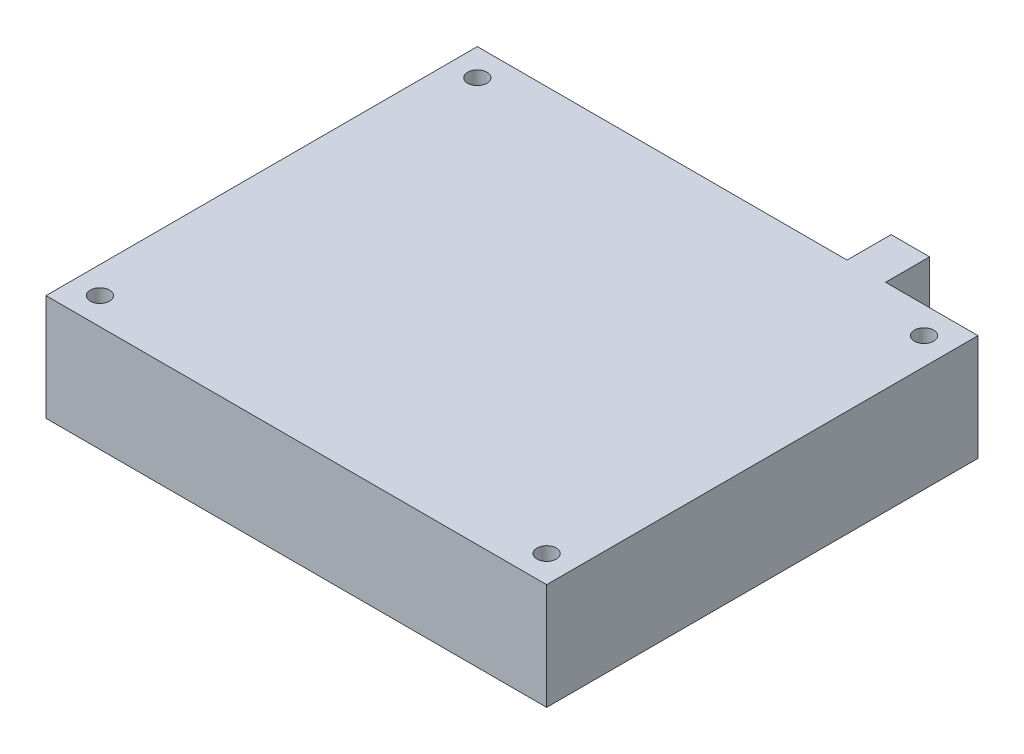
ISO-10303-21;
HEADER;
FILE_DESCRIPTION(('STEP AP214'),'2;1');
FILE_NAME('part.step','',(''),(''),'','','');
FILE_SCHEMA(('AUTOMOTIVE_DESIGN { 1 0 10303 214 1 1 1 1 }'));
ENDSEC;
DATA;
#1=APPLICATION_CONTEXT('core data for automotive mechanical design processes');
#2=APPLICATION_PROTOCOL_DEFINITION('international standard','automotive_design',2000,#1);
#3=PRODUCT_CONTEXT('',#1,'mechanical');
#4=PRODUCT('Part','Part','',(#3));
#5=PRODUCT_RELATED_PRODUCT_CATEGORY('part','',(#4));
#6=PRODUCT_DEFINITION_FORMATION('','',#4);
#7=PRODUCT_DEFINITION_CONTEXT('part definition',#1,'design');
#8=PRODUCT_DEFINITION('design','',#6,#7);
#9=PRODUCT_DEFINITION_SHAPE('','',#8);
#10=(LENGTH_UNIT() NAMED_UNIT(*) SI_UNIT(.MILLI.,.METRE.));
#11=(NAMED_UNIT(*) PLANE_ANGLE_UNIT() SI_UNIT($,.RADIAN.));
#12=(NAMED_UNIT(*) SI_UNIT($,.STERADIAN.) SOLID_ANGLE_UNIT());
#13=UNCERTAINTY_MEASURE_WITH_UNIT(LENGTH_MEASURE(1.E-05),#10,'distance_accuracy_value','');
#14=(GEOMETRIC_REPRESENTATION_CONTEXT(3) GLOBAL_UNCERTAINTY_ASSIGNED_CONTEXT((#13)) GLOBAL_UNIT_ASSIGNED_CONTEXT((#10,
#11,#12)) REPRESENTATION_CONTEXT('',''));
#15=CARTESIAN_POINT('',(0.,0.,0.));
#16=DIRECTION('',(0.,0.,1.));
#17=DIRECTION('',(1.,0.,0.));
#18=AXIS2_PLACEMENT_3D('',#15,#16,#17);
#19=CARTESIAN_POINT('',(-32.5,13.8,-28.));
#20=DIRECTION('',(0.,0.,1.));
#21=DIRECTION('',(1.,0.,0.));
#22=AXIS2_PLACEMENT_3D('',#19,#20,#21);
#23=PLANE('',#22);
#24=DIRECTION('',(0.,1.,0.));
#25=VECTOR('',#24,1.);
#26=CARTESIAN_POINT('',(15.5,-7.597262664934,-28.));
#27=LINE('',#26,#25);
#28=CARTESIAN_POINT('',(15.5,0.,-28.));
#29=VERTEX_POINT('',#28);
#30=CARTESIAN_POINT('',(15.5,13.8,-28.));
#31=VERTEX_POINT('',#30);
#32=EDGE_CURVE('E144',#29,#31,#27,.T.);
#33=ORIENTED_EDGE('',*,*,#32,.F.);
#34=DIRECTION('',(-1.,0.,0.));
#35=VECTOR('',#34,1.);
#36=CARTESIAN_POINT('',(-32.5,0.,-28.));
#37=LINE('',#36,#35);
#38=CARTESIAN_POINT('',(-32.5,0.,-28.));
#39=VERTEX_POINT('',#38);
#40=EDGE_CURVE('E184',#29,#39,#37,.T.);
#41=ORIENTED_EDGE('',*,*,#40,.T.);
#42=DIRECTION('',(0.,-1.,0.));
#43=VECTOR('',#42,1.);
#44=CARTESIAN_POINT('',(-32.5,13.8,-28.));
#45=LINE('',#44,#43);
#46=CARTESIAN_POINT('',(-32.5,13.8,-28.));
#47=VERTEX_POINT('',#46);
#48=EDGE_CURVE('E49',#47,#39,#45,.T.);
#49=ORIENTED_EDGE('',*,*,#48,.F.);
#50=DIRECTION('',(-1.,0.,0.));
#51=VECTOR('',#50,1.);
#52=CARTESIAN_POINT('',(-32.5,13.8,-28.));
#53=LINE('',#52,#51);
#54=EDGE_CURVE('E176',#31,#47,#53,.T.);
#55=ORIENTED_EDGE('',*,*,#54,.F.);
#56=EDGE_LOOP('',(#33,#41,#49,#55));
#57=FACE_BOUND('',#56,.T.);
#58=ADVANCED_FACE('F41',(#57),#23,.F.);
#59=CARTESIAN_POINT('',(0.,13.8,0.));
#60=DIRECTION('',(0.,-1.,0.));
#61=DIRECTION('',(0.,0.,-1.));
#62=AXIS2_PLACEMENT_3D('',#59,#60,#61);
#63=PLANE('',#62);
#64=DIRECTION('',(0.,0.,-1.));
#65=VECTOR('',#64,1.);
#66=CARTESIAN_POINT('',(32.5,13.8,28.));
#67=LINE('',#66,#65);
#68=CARTESIAN_POINT('',(32.5,13.8,28.));
#69=VERTEX_POINT('',#68);
#70=CARTESIAN_POINT('',(32.5,13.8,-28.));
#71=VERTEX_POINT('',#70);
#72=EDGE_CURVE('E174',#69,#71,#67,.T.);
#73=ORIENTED_EDGE('',*,*,#72,.T.);
#74=CARTESIAN_POINT('',(20.5,13.8,-28.));
#75=VERTEX_POINT('',#74);
#76=EDGE_CURVE('E92',#71,#75,#53,.T.);
#77=ORIENTED_EDGE('',*,*,#76,.T.);
#78=DIRECTION('',(0.,0.,-1.));
#79=VECTOR('',#78,1.);
#80=CARTESIAN_POINT('',(20.5,13.8,-33.72));
#81=LINE('',#80,#79);
#82=CARTESIAN_POINT('',(20.5,13.8,-33.72));
#83=VERTEX_POINT('',#82);
#84=EDGE_CURVE('E56',#75,#83,#81,.T.);
#85=ORIENTED_EDGE('',*,*,#84,.T.);
#86=DIRECTION('',(-1.,0.,0.));
#87=VECTOR('',#86,1.);
#88=CARTESIAN_POINT('',(15.5,13.8,-33.72));
#89=LINE('',#88,#87);
#90=CARTESIAN_POINT('',(15.5,13.8,-33.72));
#91=VERTEX_POINT('',#90);
#92=EDGE_CURVE('E132',#83,#91,#89,.T.);
#93=ORIENTED_EDGE('',*,*,#92,.T.);
#94=DIRECTION('',(0.,0.,1.));
#95=VECTOR('',#94,1.);
#96=CARTESIAN_POINT('',(15.5,13.8,-28.));
#97=LINE('',#96,#95);
#98=EDGE_CURVE('E137',#91,#31,#97,.T.);
#99=ORIENTED_EDGE('',*,*,#98,.T.);
#100=ORIENTED_EDGE('',*,*,#54,.T.);
#101=DIRECTION('',(0.,0.,1.));
#102=VECTOR('',#101,1.);
#103=CARTESIAN_POINT('',(-32.5,13.8,28.));
#104=LINE('',#103,#102);
#105=CARTESIAN_POINT('',(-32.5,13.8,28.));
#106=VERTEX_POINT('',#105);
#107=EDGE_CURVE('E178',#47,#106,#104,.T.);
#108=ORIENTED_EDGE('',*,*,#107,.T.);
#109=DIRECTION('',(1.,0.,0.));
#110=VECTOR('',#109,1.);
#111=CARTESIAN_POINT('',(-32.5,13.8,28.));
#112=LINE('',#111,#110);
#113=EDGE_CURVE('E65',#106,#69,#112,.T.);
#114=ORIENTED_EDGE('',*,*,#113,.T.);
#115=EDGE_LOOP('',(#73,#77,#85,#93,#99,#100,#108,#114));
#116=FACE_BOUND('',#115,.T.);
#117=CARTESIAN_POINT('',(-29.,13.8,-24.5));
#118=DIRECTION('',(0.,1.,0.));
#119=DIRECTION('',(0.,0.,1.));
#120=AXIS2_PLACEMENT_3D('',#117,#118,#119);
#121=CIRCLE('',#120,1.25);
#122=CARTESIAN_POINT('',(-29.,13.8,-25.75));
#123=VERTEX_POINT('',#122);
#124=EDGE_CURVE('E168',#123,#123,#121,.T.);
#125=ORIENTED_EDGE('',*,*,#124,.F.);
#126=EDGE_LOOP('',(#125));
#127=FACE_BOUND('',#126,.T.);
#128=CARTESIAN_POINT('',(29.,13.8,-24.5));
#129=DIRECTION('',(0.,1.,0.));
#130=DIRECTION('',(0.,0.,-1.));
#131=AXIS2_PLACEMENT_3D('',#128,#129,#130);
#132=CIRCLE('',#131,1.25);
#133=CARTESIAN_POINT('',(29.,13.8,-25.75));
#134=VERTEX_POINT('',#133);
#135=EDGE_CURVE('E162',#134,#134,#132,.T.);
#136=ORIENTED_EDGE('',*,*,#135,.F.);
#137=EDGE_LOOP('',(#136));
#138=FACE_BOUND('',#137,.T.);
#139=CARTESIAN_POINT('',(29.,13.8,24.5));
#140=DIRECTION('',(0.,1.,0.));
#141=DIRECTION('',(0.,0.,1.));
#142=AXIS2_PLACEMENT_3D('',#139,#140,#141);
#143=CIRCLE('',#142,1.25);
#144=CARTESIAN_POINT('',(29.,13.8,23.25));
#145=VERTEX_POINT('',#144);
#146=EDGE_CURVE('E156',#145,#145,#143,.T.);
#147=ORIENTED_EDGE('',*,*,#146,.F.);
#148=EDGE_LOOP('',(#147));
#149=FACE_BOUND('',#148,.T.);
#150=CARTESIAN_POINT('',(-29.,13.8,24.5));
#151=DIRECTION('',(0.,1.,0.));
#152=DIRECTION('',(0.,0.,-1.));
#153=AXIS2_PLACEMENT_3D('',#150,#151,#152);
#154=CIRCLE('',#153,1.25);
#155=CARTESIAN_POINT('',(-29.,13.8,23.25));
#156=VERTEX_POINT('',#155);
#157=EDGE_CURVE('E150',#156,#156,#154,.T.);
#158=ORIENTED_EDGE('',*,*,#157,.F.);
#159=EDGE_LOOP('',(#158));
#160=FACE_BOUND('',#159,.T.);
#161=ADVANCED_FACE('F219',(#116,#127,#138,#149,#160),#63,.F.);
#162=CARTESIAN_POINT('',(0.,0.,0.));
#163=DIRECTION('',(0.,-1.,0.));
#164=DIRECTION('',(0.,0.,-1.));
#165=AXIS2_PLACEMENT_3D('',#162,#163,#164);
#166=PLANE('',#165);
#167=CARTESIAN_POINT('',(29.,0.,24.5));
#168=DIRECTION('',(0.,1.,0.));
#169=DIRECTION('',(0.,0.,1.));
#170=AXIS2_PLACEMENT_3D('',#167,#168,#169);
#171=CIRCLE('',#170,1.25);
#172=CARTESIAN_POINT('',(29.,0.,23.25));
#173=VERTEX_POINT('',#172);
#174=EDGE_CURVE('E153',#173,#173,#171,.T.);
#175=ORIENTED_EDGE('',*,*,#174,.T.);
#176=EDGE_LOOP('',(#175));
#177=FACE_BOUND('',#176,.T.);
#178=CARTESIAN_POINT('',(-29.,0.,-24.5));
#179=DIRECTION('',(0.,1.,0.));
#180=DIRECTION('',(0.,0.,1.));
#181=AXIS2_PLACEMENT_3D('',#178,#179,#180);
#182=CIRCLE('',#181,1.25);
#183=CARTESIAN_POINT('',(-29.,0.,-25.75));
#184=VERTEX_POINT('',#183);
#185=EDGE_CURVE('E165',#184,#184,#182,.T.);
#186=ORIENTED_EDGE('',*,*,#185,.T.);
#187=EDGE_LOOP('',(#186));
#188=FACE_BOUND('',#187,.T.);
#189=DIRECTION('',(0.,0.,-1.));
#190=VECTOR('',#189,1.);
#191=CARTESIAN_POINT('',(32.5,0.,28.));
#192=LINE('',#191,#190);
#193=CARTESIAN_POINT('',(32.5,0.,28.));
#194=VERTEX_POINT('',#193);
#195=CARTESIAN_POINT('',(32.5,0.,-28.));
#196=VERTEX_POINT('',#195);
#197=EDGE_CURVE('E171',#194,#196,#192,.T.);
#198=ORIENTED_EDGE('',*,*,#197,.F.);
#199=DIRECTION('',(1.,0.,0.));
#200=VECTOR('',#199,1.);
#201=CARTESIAN_POINT('',(-32.5,0.,28.));
#202=LINE('',#201,#200);
#203=CARTESIAN_POINT('',(-32.5,0.,28.));
#204=VERTEX_POINT('',#203);
#205=EDGE_CURVE('E86',#204,#194,#202,.T.);
#206=ORIENTED_EDGE('',*,*,#205,.F.);
#207=DIRECTION('',(0.,0.,1.));
#208=VECTOR('',#207,1.);
#209=CARTESIAN_POINT('',(-32.5,0.,28.));
#210=LINE('',#209,#208);
#211=EDGE_CURVE('E187',#39,#204,#210,.T.);
#212=ORIENTED_EDGE('',*,*,#211,.F.);
#213=ORIENTED_EDGE('',*,*,#40,.F.);
#214=DIRECTION('',(0.,0.,1.));
#215=VECTOR('',#214,1.);
#216=CARTESIAN_POINT('',(15.5,0.,-28.));
#217=LINE('',#216,#215);
#218=CARTESIAN_POINT('',(15.5,0.,-33.72));
#219=VERTEX_POINT('',#218);
#220=EDGE_CURVE('E123',#219,#29,#217,.T.);
#221=ORIENTED_EDGE('',*,*,#220,.F.);
#222=DIRECTION('',(-1.,0.,0.));
#223=VECTOR('',#222,1.);
#224=CARTESIAN_POINT('',(15.5,0.,-33.72));
#225=LINE('',#224,#223);
#226=CARTESIAN_POINT('',(20.5,0.,-33.72));
#227=VERTEX_POINT('',#226);
#228=EDGE_CURVE('E115',#227,#219,#225,.T.);
#229=ORIENTED_EDGE('',*,*,#228,.F.);
#230=DIRECTION('',(0.,0.,-1.));
#231=VECTOR('',#230,1.);
#232=CARTESIAN_POINT('',(20.5,0.,-33.72));
#233=LINE('',#232,#231);
#234=CARTESIAN_POINT('',(20.5,0.,-28.));
#235=VERTEX_POINT('',#234);
#236=EDGE_CURVE('E121',#235,#227,#233,.T.);
#237=ORIENTED_EDGE('',*,*,#236,.F.);
#238=EDGE_CURVE('E185',#196,#235,#37,.T.);
#239=ORIENTED_EDGE('',*,*,#238,.F.);
#240=EDGE_LOOP('',(#198,#206,#212,#213,#221,#229,#237,#239));
#241=FACE_BOUND('',#240,.T.);
#242=CARTESIAN_POINT('',(29.,0.,-24.5));
#243=DIRECTION('',(0.,1.,0.));
#244=DIRECTION('',(0.,0.,-1.));
#245=AXIS2_PLACEMENT_3D('',#242,#243,#244);
#246=CIRCLE('',#245,1.25);
#247=CARTESIAN_POINT('',(29.,0.,-25.75));
#248=VERTEX_POINT('',#247);
#249=EDGE_CURVE('E159',#248,#248,#246,.T.);
#250=ORIENTED_EDGE('',*,*,#249,.T.);
#251=EDGE_LOOP('',(#250));
#252=FACE_BOUND('',#251,.T.);
#253=CARTESIAN_POINT('',(-29.,0.,24.5));
#254=DIRECTION('',(0.,1.,0.));
#255=DIRECTION('',(0.,0.,-1.));
#256=AXIS2_PLACEMENT_3D('',#253,#254,#255);
#257=CIRCLE('',#256,1.25);
#258=CARTESIAN_POINT('',(-29.,0.,23.25));
#259=VERTEX_POINT('',#258);
#260=EDGE_CURVE('E149',#259,#259,#257,.T.);
#261=ORIENTED_EDGE('',*,*,#260,.T.);
#262=EDGE_LOOP('',(#261));
#263=FACE_BOUND('',#262,.T.);
#264=ADVANCED_FACE('F118',(#177,#188,#241,#252,#263),#166,.T.);
#265=CARTESIAN_POINT('',(32.5,13.8,28.));
#266=DIRECTION('',(-1.,0.,0.));
#267=DIRECTION('',(0.,0.,1.));
#268=AXIS2_PLACEMENT_3D('',#265,#266,#267);
#269=PLANE('',#268);
#270=ORIENTED_EDGE('',*,*,#197,.T.);
#271=DIRECTION('',(0.,-1.,0.));
#272=VECTOR('',#271,1.);
#273=CARTESIAN_POINT('',(32.5,13.8,-28.));
#274=LINE('',#273,#272);
#275=EDGE_CURVE('E11',#71,#196,#274,.T.);
#276=ORIENTED_EDGE('',*,*,#275,.F.);
#277=ORIENTED_EDGE('',*,*,#72,.F.);
#278=DIRECTION('',(0.,-1.,0.));
#279=VECTOR('',#278,1.);
#280=CARTESIAN_POINT('',(32.5,13.8,28.));
#281=LINE('',#280,#279);
#282=EDGE_CURVE('E181',#69,#194,#281,.T.);
#283=ORIENTED_EDGE('',*,*,#282,.T.);
#284=EDGE_LOOP('',(#270,#276,#277,#283));
#285=FACE_BOUND('',#284,.T.);
#286=ADVANCED_FACE('F43',(#285),#269,.F.);
#287=ORIENTED_EDGE('',*,*,#238,.T.);
#288=DIRECTION('',(0.,1.,0.));
#289=VECTOR('',#288,1.);
#290=CARTESIAN_POINT('',(20.5,-7.597262664934,-28.));
#291=LINE('',#290,#289);
#292=EDGE_CURVE('E135',#235,#75,#291,.T.);
#293=ORIENTED_EDGE('',*,*,#292,.T.);
#294=ORIENTED_EDGE('',*,*,#76,.F.);
#295=ORIENTED_EDGE('',*,*,#275,.T.);
#296=EDGE_LOOP('',(#287,#293,#294,#295));
#297=FACE_BOUND('',#296,.T.);
#298=ADVANCED_FACE('F215',(#297),#23,.F.);
#299=CARTESIAN_POINT('',(-32.5,13.8,28.));
#300=DIRECTION('',(1.,0.,0.));
#301=DIRECTION('',(0.,0.,-1.));
#302=AXIS2_PLACEMENT_3D('',#299,#300,#301);
#303=PLANE('',#302);
#304=ORIENTED_EDGE('',*,*,#211,.T.);
#305=DIRECTION('',(0.,-1.,0.));
#306=VECTOR('',#305,1.);
#307=CARTESIAN_POINT('',(-32.5,13.8,28.));
#308=LINE('',#307,#306);
#309=EDGE_CURVE('E191',#106,#204,#308,.T.);
#310=ORIENTED_EDGE('',*,*,#309,.F.);
#311=ORIENTED_EDGE('',*,*,#107,.F.);
#312=ORIENTED_EDGE('',*,*,#48,.T.);
#313=EDGE_LOOP('',(#304,#310,#311,#312));
#314=FACE_BOUND('',#313,.T.);
#315=ADVANCED_FACE('F197',(#314),#303,.F.);
#316=CARTESIAN_POINT('',(-32.5,13.8,28.));
#317=DIRECTION('',(0.,0.,-1.));
#318=DIRECTION('',(-1.,0.,0.));
#319=AXIS2_PLACEMENT_3D('',#316,#317,#318);
#320=PLANE('',#319);
#321=ORIENTED_EDGE('',*,*,#205,.T.);
#322=ORIENTED_EDGE('',*,*,#282,.F.);
#323=ORIENTED_EDGE('',*,*,#113,.F.);
#324=ORIENTED_EDGE('',*,*,#309,.T.);
#325=EDGE_LOOP('',(#321,#322,#323,#324));
#326=FACE_BOUND('',#325,.T.);
#327=ADVANCED_FACE('F204',(#326),#320,.F.);
#328=CARTESIAN_POINT('',(-29.,13.8,-24.5));
#329=DIRECTION('',(0.,-1.,0.));
#330=DIRECTION('',(0.,0.,-1.));
#331=AXIS2_PLACEMENT_3D('',#328,#329,#330);
#332=CYLINDRICAL_SURFACE('',#331,1.25);
#333=CARTESIAN_POINT('',(-29.,13.8,-25.75));
#334=CARTESIAN_POINT('',(-29.,13.65625,-25.75));
#335=CARTESIAN_POINT('',(-29.,13.5125,-25.75));
#336=CARTESIAN_POINT('',(-29.,13.225,-25.75));
#337=CARTESIAN_POINT('',(-29.,13.08125,-25.75));
#338=CARTESIAN_POINT('',(-29.,12.79375,-25.75));
#339=CARTESIAN_POINT('',(-29.,12.65,-25.75));
#340=CARTESIAN_POINT('',(-29.,12.3625,-25.75));
#341=CARTESIAN_POINT('',(-29.,12.21875,-25.75));
#342=CARTESIAN_POINT('',(-29.,11.93125,-25.75));
#343=CARTESIAN_POINT('',(-29.,11.7875,-25.75));
#344=CARTESIAN_POINT('',(-29.,11.5,-25.75));
#345=CARTESIAN_POINT('',(-29.,11.35625,-25.75));
#346=CARTESIAN_POINT('',(-29.,11.06875,-25.75));
#347=CARTESIAN_POINT('',(-29.,10.925,-25.75));
#348=CARTESIAN_POINT('',(-29.,10.6375,-25.75));
#349=CARTESIAN_POINT('',(-29.,10.49375,-25.75));
#350=CARTESIAN_POINT('',(-29.,10.20625,-25.75));
#351=CARTESIAN_POINT('',(-29.,10.0625,-25.75));
#352=CARTESIAN_POINT('',(-29.,9.775,-25.75));
#353=CARTESIAN_POINT('',(-29.,9.63125,-25.75));
#354=CARTESIAN_POINT('',(-29.,9.34375,-25.75));
#355=CARTESIAN_POINT('',(-29.,9.2,-25.75));
#356=CARTESIAN_POINT('',(-29.,8.9125,-25.75));
#357=CARTESIAN_POINT('',(-29.,8.76875,-25.75));
#358=CARTESIAN_POINT('',(-29.,8.48125,-25.75));
#359=CARTESIAN_POINT('',(-29.,8.3375,-25.75));
#360=CARTESIAN_POINT('',(-29.,8.05,-25.75));
#361=CARTESIAN_POINT('',(-29.,7.90625,-25.75));
#362=CARTESIAN_POINT('',(-29.,7.61875,-25.75));
#363=CARTESIAN_POINT('',(-29.,7.475,-25.75));
#364=CARTESIAN_POINT('',(-29.,7.1875,-25.75));
#365=CARTESIAN_POINT('',(-29.,7.04375,-25.75));
#366=CARTESIAN_POINT('',(-29.,6.75625,-25.75));
#367=CARTESIAN_POINT('',(-29.,6.6125,-25.75));
#368=CARTESIAN_POINT('',(-29.,6.325,-25.75));
#369=CARTESIAN_POINT('',(-29.,6.18125,-25.75));
#370=CARTESIAN_POINT('',(-29.,5.89375,-25.75));
#371=CARTESIAN_POINT('',(-29.,5.75,-25.75));
#372=CARTESIAN_POINT('',(-29.,5.4625,-25.75));
#373=CARTESIAN_POINT('',(-29.,5.31875,-25.75));
#374=CARTESIAN_POINT('',(-29.,5.03125,-25.75));
#375=CARTESIAN_POINT('',(-29.,4.8875,-25.75));
#376=CARTESIAN_POINT('',(-29.,4.6,-25.75));
#377=CARTESIAN_POINT('',(-29.,4.45625,-25.75));
#378=CARTESIAN_POINT('',(-29.,4.16875,-25.75));
#379=CARTESIAN_POINT('',(-29.,4.025,-25.75));
#380=CARTESIAN_POINT('',(-29.,3.7375,-25.75));
#381=CARTESIAN_POINT('',(-29.,3.59375,-25.75));
#382=CARTESIAN_POINT('',(-29.,3.30625,-25.75));
#383=CARTESIAN_POINT('',(-29.,3.1625,-25.75));
#384=CARTESIAN_POINT('',(-29.,2.875,-25.75));
#385=CARTESIAN_POINT('',(-29.,2.73125,-25.75));
#386=CARTESIAN_POINT('',(-29.,2.44375,-25.75));
#387=CARTESIAN_POINT('',(-29.,2.3,-25.75));
#388=CARTESIAN_POINT('',(-29.,2.0125,-25.75));
#389=CARTESIAN_POINT('',(-29.,1.86875,-25.75));
#390=CARTESIAN_POINT('',(-29.,1.58125,-25.75));
#391=CARTESIAN_POINT('',(-29.,1.4375,-25.75));
#392=CARTESIAN_POINT('',(-29.,1.15,-25.75));
#393=CARTESIAN_POINT('',(-29.,1.00625,-25.75));
#394=CARTESIAN_POINT('',(-29.,0.71875,-25.75));
#395=CARTESIAN_POINT('',(-29.,0.575,-25.75));
#396=CARTESIAN_POINT('',(-29.,0.2875,-25.75));
#397=CARTESIAN_POINT('',(-29.,0.14375,-25.75));
#398=CARTESIAN_POINT('',(-29.,0.,-25.75));
#399=B_SPLINE_CURVE_WITH_KNOTS('',3,(#333,#334,#335,#336,#337,#338,#339,#340,#341,#342,#343,
#344,#345,#346,#347,#348,#349,#350,#351,#352,#353,#354,#355,#356,#357,#358,#359,#360,#361,#362,
#363,#364,#365,#366,#367,#368,#369,#370,#371,#372,#373,#374,#375,#376,#377,#378,#379,#380,#381,
#382,#383,#384,#385,#386,#387,#388,#389,#390,#391,#392,#393,#394,#395,#396,#397,#398),
.UNSPECIFIED.,.F.,.F.,(4,2,2,2,2,2,2,2,2,2,2,2,2,2,2,2,2,2,2,2,2,2,2,2,2,2,2,2,2,2,2,2,4),(0.,
0.431250000000001,0.8625,1.29375,1.725,2.15625,2.5875,3.01875,3.45,3.88125,4.3125,4.74375,5.175,
5.60625,6.0375,6.46875,6.9,7.33125,7.7625,8.19375,8.625,9.05625,9.4875,9.91875,10.35,10.78125,
11.2125,11.64375,12.075,12.50625,12.9375,13.36875,13.8),.UNSPECIFIED.);
#400=EDGE_CURVE('BSEAM206',#123,#184,#399,.T.);
#401=ORIENTED_EDGE('',*,*,#124,.T.);
#402=ORIENTED_EDGE('',*,*,#185,.F.);
#403=ORIENTED_EDGE('',*,*,#400,.T.);
#404=ORIENTED_EDGE('',*,*,#400,.F.);
#405=EDGE_LOOP('',(#401,#403,#402,#404));
#406=FACE_BOUND('',#405,.T.);
#407=ADVANCED_FACE('F206',(#406),#332,.F.);
#408=CARTESIAN_POINT('',(29.,13.8,-24.5));
#409=DIRECTION('',(0.,-1.,0.));
#410=DIRECTION('',(0.,0.,-1.));
#411=AXIS2_PLACEMENT_3D('',#408,#409,#410);
#412=CYLINDRICAL_SURFACE('',#411,1.25);
#413=CARTESIAN_POINT('',(29.,13.8,-25.75));
#414=CARTESIAN_POINT('',(29.,13.65625,-25.75));
#415=CARTESIAN_POINT('',(29.,13.5125,-25.75));
#416=CARTESIAN_POINT('',(29.,13.225,-25.75));
#417=CARTESIAN_POINT('',(29.,13.08125,-25.75));
#418=CARTESIAN_POINT('',(29.,12.79375,-25.75));
#419=CARTESIAN_POINT('',(29.,12.65,-25.75));
#420=CARTESIAN_POINT('',(29.,12.3625,-25.75));
#421=CARTESIAN_POINT('',(29.,12.21875,-25.75));
#422=CARTESIAN_POINT('',(29.,11.93125,-25.75));
#423=CARTESIAN_POINT('',(29.,11.7875,-25.75));
#424=CARTESIAN_POINT('',(29.,11.5,-25.75));
#425=CARTESIAN_POINT('',(29.,11.35625,-25.75));
#426=CARTESIAN_POINT('',(29.,11.06875,-25.75));
#427=CARTESIAN_POINT('',(29.,10.925,-25.75));
#428=CARTESIAN_POINT('',(29.,10.6375,-25.75));
#429=CARTESIAN_POINT('',(29.,10.49375,-25.75));
#430=CARTESIAN_POINT('',(29.,10.20625,-25.75));
#431=CARTESIAN_POINT('',(29.,10.0625,-25.75));
#432=CARTESIAN_POINT('',(29.,9.775,-25.75));
#433=CARTESIAN_POINT('',(29.,9.63125,-25.75));
#434=CARTESIAN_POINT('',(29.,9.34375,-25.75));
#435=CARTESIAN_POINT('',(29.,9.2,-25.75));
#436=CARTESIAN_POINT('',(29.,8.9125,-25.75));
#437=CARTESIAN_POINT('',(29.,8.76875,-25.75));
#438=CARTESIAN_POINT('',(29.,8.48125,-25.75));
#439=CARTESIAN_POINT('',(29.,8.3375,-25.75));
#440=CARTESIAN_POINT('',(29.,8.05,-25.75));
#441=CARTESIAN_POINT('',(29.,7.90625,-25.75));
#442=CARTESIAN_POINT('',(29.,7.61875,-25.75));
#443=CARTESIAN_POINT('',(29.,7.475,-25.75));
#444=CARTESIAN_POINT('',(29.,7.1875,-25.75));
#445=CARTESIAN_POINT('',(29.,7.04375,-25.75));
#446=CARTESIAN_POINT('',(29.,6.75625,-25.75));
#447=CARTESIAN_POINT('',(29.,6.6125,-25.75));
#448=CARTESIAN_POINT('',(29.,6.325,-25.75));
#449=CARTESIAN_POINT('',(29.,6.18125,-25.75));
#450=CARTESIAN_POINT('',(29.,5.89375,-25.75));
#451=CARTESIAN_POINT('',(29.,5.75,-25.75));
#452=CARTESIAN_POINT('',(29.,5.4625,-25.75));
#453=CARTESIAN_POINT('',(29.,5.31875,-25.75));
#454=CARTESIAN_POINT('',(29.,5.03125,-25.75));
#455=CARTESIAN_POINT('',(29.,4.8875,-25.75));
#456=CARTESIAN_POINT('',(29.,4.6,-25.75));
#457=CARTESIAN_POINT('',(29.,4.45625,-25.75));
#458=CARTESIAN_POINT('',(29.,4.16875,-25.75));
#459=CARTESIAN_POINT('',(29.,4.025,-25.75));
#460=CARTESIAN_POINT('',(29.,3.7375,-25.75));
#461=CARTESIAN_POINT('',(29.,3.59375,-25.75));
#462=CARTESIAN_POINT('',(29.,3.30625,-25.75));
#463=CARTESIAN_POINT('',(29.,3.1625,-25.75));
#464=CARTESIAN_POINT('',(29.,2.875,-25.75));
#465=CARTESIAN_POINT('',(29.,2.73125,-25.75));
#466=CARTESIAN_POINT('',(29.,2.44375,-25.75));
#467=CARTESIAN_POINT('',(29.,2.3,-25.75));
#468=CARTESIAN_POINT('',(29.,2.0125,-25.75));
#469=CARTESIAN_POINT('',(29.,1.86875,-25.75));
#470=CARTESIAN_POINT('',(29.,1.58125,-25.75));
#471=CARTESIAN_POINT('',(29.,1.4375,-25.75));
#472=CARTESIAN_POINT('',(29.,1.15,-25.75));
#473=CARTESIAN_POINT('',(29.,1.00625,-25.75));
#474=CARTESIAN_POINT('',(29.,0.71875,-25.75));
#475=CARTESIAN_POINT('',(29.,0.575,-25.75));
#476=CARTESIAN_POINT('',(29.,0.2875,-25.75));
#477=CARTESIAN_POINT('',(29.,0.14375,-25.75));
#478=CARTESIAN_POINT('',(29.,0.,-25.75));
#479=B_SPLINE_CURVE_WITH_KNOTS('',3,(#413,#414,#415,#416,#417,#418,#419,#420,#421,#422,#423,
#424,#425,#426,#427,#428,#429,#430,#431,#432,#433,#434,#435,#436,#437,#438,#439,#440,#441,#442,
#443,#444,#445,#446,#447,#448,#449,#450,#451,#452,#453,#454,#455,#456,#457,#458,#459,#460,#461,
#462,#463,#464,#465,#466,#467,#468,#469,#470,#471,#472,#473,#474,#475,#476,#477,#478),
.UNSPECIFIED.,.F.,.F.,(4,2,2,2,2,2,2,2,2,2,2,2,2,2,2,2,2,2,2,2,2,2,2,2,2,2,2,2,2,2,2,2,4),(0.,
0.431250000000001,0.8625,1.29375,1.725,2.15625,2.5875,3.01875,3.45,3.88125,4.3125,4.74375,5.175,
5.60625,6.0375,6.46875,6.9,7.33125,7.7625,8.19375,8.625,9.05625,9.4875,9.91875,10.35,10.78125,
11.2125,11.64375,12.075,12.50625,12.9375,13.36875,13.8),.UNSPECIFIED.);
#480=EDGE_CURVE('BSEAM212',#134,#248,#479,.T.);
#481=ORIENTED_EDGE('',*,*,#135,.T.);
#482=ORIENTED_EDGE('',*,*,#249,.F.);
#483=ORIENTED_EDGE('',*,*,#480,.T.);
#484=ORIENTED_EDGE('',*,*,#480,.F.);
#485=EDGE_LOOP('',(#481,#483,#482,#484));
#486=FACE_BOUND('',#485,.T.);
#487=ADVANCED_FACE('F212',(#486),#412,.F.);
#488=CARTESIAN_POINT('',(29.,13.8,24.5));
#489=DIRECTION('',(0.,-1.,0.));
#490=DIRECTION('',(0.,0.,-1.));
#491=AXIS2_PLACEMENT_3D('',#488,#489,#490);
#492=CYLINDRICAL_SURFACE('',#491,1.25);
#493=CARTESIAN_POINT('',(29.,13.8,23.25));
#494=CARTESIAN_POINT('',(29.,13.65625,23.25));
#495=CARTESIAN_POINT('',(29.,13.5125,23.25));
#496=CARTESIAN_POINT('',(29.,13.225,23.25));
#497=CARTESIAN_POINT('',(29.,13.08125,23.25));
#498=CARTESIAN_POINT('',(29.,12.79375,23.25));
#499=CARTESIAN_POINT('',(29.,12.65,23.25));
#500=CARTESIAN_POINT('',(29.,12.3625,23.25));
#501=CARTESIAN_POINT('',(29.,12.21875,23.25));
#502=CARTESIAN_POINT('',(29.,11.93125,23.25));
#503=CARTESIAN_POINT('',(29.,11.7875,23.25));
#504=CARTESIAN_POINT('',(29.,11.5,23.25));
#505=CARTESIAN_POINT('',(29.,11.35625,23.25));
#506=CARTESIAN_POINT('',(29.,11.06875,23.25));
#507=CARTESIAN_POINT('',(29.,10.925,23.25));
#508=CARTESIAN_POINT('',(29.,10.6375,23.25));
#509=CARTESIAN_POINT('',(29.,10.49375,23.25));
#510=CARTESIAN_POINT('',(29.,10.20625,23.25));
#511=CARTESIAN_POINT('',(29.,10.0625,23.25));
#512=CARTESIAN_POINT('',(29.,9.775,23.25));
#513=CARTESIAN_POINT('',(29.,9.63125,23.25));
#514=CARTESIAN_POINT('',(29.,9.34375,23.25));
#515=CARTESIAN_POINT('',(29.,9.2,23.25));
#516=CARTESIAN_POINT('',(29.,8.9125,23.25));
#517=CARTESIAN_POINT('',(29.,8.76875,23.25));
#518=CARTESIAN_POINT('',(29.,8.48125,23.25));
#519=CARTESIAN_POINT('',(29.,8.3375,23.25));
#520=CARTESIAN_POINT('',(29.,8.05,23.25));
#521=CARTESIAN_POINT('',(29.,7.90625,23.25));
#522=CARTESIAN_POINT('',(29.,7.61875,23.25));
#523=CARTESIAN_POINT('',(29.,7.475,23.25));
#524=CARTESIAN_POINT('',(29.,7.1875,23.25));
#525=CARTESIAN_POINT('',(29.,7.04375,23.25));
#526=CARTESIAN_POINT('',(29.,6.75625,23.25));
#527=CARTESIAN_POINT('',(29.,6.6125,23.25));
#528=CARTESIAN_POINT('',(29.,6.325,23.25));
#529=CARTESIAN_POINT('',(29.,6.18125,23.25));
#530=CARTESIAN_POINT('',(29.,5.89375,23.25));
#531=CARTESIAN_POINT('',(29.,5.75,23.25));
#532=CARTESIAN_POINT('',(29.,5.4625,23.25));
#533=CARTESIAN_POINT('',(29.,5.31875,23.25));
#534=CARTESIAN_POINT('',(29.,5.03125,23.25));
#535=CARTESIAN_POINT('',(29.,4.8875,23.25));
#536=CARTESIAN_POINT('',(29.,4.6,23.25));
#537=CARTESIAN_POINT('',(29.,4.45625,23.25));
#538=CARTESIAN_POINT('',(29.,4.16875,23.25));
#539=CARTESIAN_POINT('',(29.,4.025,23.25));
#540=CARTESIAN_POINT('',(29.,3.7375,23.25));
#541=CARTESIAN_POINT('',(29.,3.59375,23.25));
#542=CARTESIAN_POINT('',(29.,3.30625,23.25));
#543=CARTESIAN_POINT('',(29.,3.1625,23.25));
#544=CARTESIAN_POINT('',(29.,2.875,23.25));
#545=CARTESIAN_POINT('',(29.,2.73125,23.25));
#546=CARTESIAN_POINT('',(29.,2.44375,23.25));
#547=CARTESIAN_POINT('',(29.,2.3,23.25));
#548=CARTESIAN_POINT('',(29.,2.0125,23.25));
#549=CARTESIAN_POINT('',(29.,1.86875,23.25));
#550=CARTESIAN_POINT('',(29.,1.58125,23.25));
#551=CARTESIAN_POINT('',(29.,1.4375,23.25));
#552=CARTESIAN_POINT('',(29.,1.15,23.25));
#553=CARTESIAN_POINT('',(29.,1.00625,23.25));
#554=CARTESIAN_POINT('',(29.,0.71875,23.25));
#555=CARTESIAN_POINT('',(29.,0.575,23.25));
#556=CARTESIAN_POINT('',(29.,0.2875,23.25));
#557=CARTESIAN_POINT('',(29.,0.14375,23.25));
#558=CARTESIAN_POINT('',(29.,0.,23.25));
#559=B_SPLINE_CURVE_WITH_KNOTS('',3,(#493,#494,#495,#496,#497,#498,#499,#500,#501,#502,#503,
#504,#505,#506,#507,#508,#509,#510,#511,#512,#513,#514,#515,#516,#517,#518,#519,#520,#521,#522,
#523,#524,#525,#526,#527,#528,#529,#530,#531,#532,#533,#534,#535,#536,#537,#538,#539,#540,#541,
#542,#543,#544,#545,#546,#547,#548,#549,#550,#551,#552,#553,#554,#555,#556,#557,#558),
.UNSPECIFIED.,.F.,.F.,(4,2,2,2,2,2,2,2,2,2,2,2,2,2,2,2,2,2,2,2,2,2,2,2,2,2,2,2,2,2,2,2,4),(0.,
0.431250000000001,0.8625,1.29375,1.725,2.15625,2.5875,3.01875,3.45,3.88125,4.3125,4.74375,5.175,
5.60625,6.0375,6.46875,6.9,7.33125,7.7625,8.19375,8.625,9.05625,9.4875,9.91875,10.35,10.78125,
11.2125,11.64375,12.075,12.50625,12.9375,13.36875,13.8),.UNSPECIFIED.);
#560=EDGE_CURVE('BSEAM246',#145,#173,#559,.T.);
#561=ORIENTED_EDGE('',*,*,#146,.T.);
#562=ORIENTED_EDGE('',*,*,#174,.F.);
#563=ORIENTED_EDGE('',*,*,#560,.T.);
#564=ORIENTED_EDGE('',*,*,#560,.F.);
#565=EDGE_LOOP('',(#561,#563,#562,#564));
#566=FACE_BOUND('',#565,.T.);
#567=ADVANCED_FACE('F246',(#566),#492,.F.);
#568=CARTESIAN_POINT('',(-29.,13.8,24.5));
#569=DIRECTION('',(0.,-1.,0.));
#570=DIRECTION('',(0.,0.,-1.));
#571=AXIS2_PLACEMENT_3D('',#568,#569,#570);
#572=CYLINDRICAL_SURFACE('',#571,1.25);
#573=CARTESIAN_POINT('',(-29.,13.8,23.25));
#574=CARTESIAN_POINT('',(-29.,13.65625,23.25));
#575=CARTESIAN_POINT('',(-29.,13.5125,23.25));
#576=CARTESIAN_POINT('',(-29.,13.225,23.25));
#577=CARTESIAN_POINT('',(-29.,13.08125,23.25));
#578=CARTESIAN_POINT('',(-29.,12.79375,23.25));
#579=CARTESIAN_POINT('',(-29.,12.65,23.25));
#580=CARTESIAN_POINT('',(-29.,12.3625,23.25));
#581=CARTESIAN_POINT('',(-29.,12.21875,23.25));
#582=CARTESIAN_POINT('',(-29.,11.93125,23.25));
#583=CARTESIAN_POINT('',(-29.,11.7875,23.25));
#584=CARTESIAN_POINT('',(-29.,11.5,23.25));
#585=CARTESIAN_POINT('',(-29.,11.35625,23.25));
#586=CARTESIAN_POINT('',(-29.,11.06875,23.25));
#587=CARTESIAN_POINT('',(-29.,10.925,23.25));
#588=CARTESIAN_POINT('',(-29.,10.6375,23.25));
#589=CARTESIAN_POINT('',(-29.,10.49375,23.25));
#590=CARTESIAN_POINT('',(-29.,10.20625,23.25));
#591=CARTESIAN_POINT('',(-29.,10.0625,23.25));
#592=CARTESIAN_POINT('',(-29.,9.775,23.25));
#593=CARTESIAN_POINT('',(-29.,9.63125,23.25));
#594=CARTESIAN_POINT('',(-29.,9.34375,23.25));
#595=CARTESIAN_POINT('',(-29.,9.2,23.25));
#596=CARTESIAN_POINT('',(-29.,8.9125,23.25));
#597=CARTESIAN_POINT('',(-29.,8.76875,23.25));
#598=CARTESIAN_POINT('',(-29.,8.48125,23.25));
#599=CARTESIAN_POINT('',(-29.,8.3375,23.25));
#600=CARTESIAN_POINT('',(-29.,8.05,23.25));
#601=CARTESIAN_POINT('',(-29.,7.90625,23.25));
#602=CARTESIAN_POINT('',(-29.,7.61875,23.25));
#603=CARTESIAN_POINT('',(-29.,7.475,23.25));
#604=CARTESIAN_POINT('',(-29.,7.1875,23.25));
#605=CARTESIAN_POINT('',(-29.,7.04375,23.25));
#606=CARTESIAN_POINT('',(-29.,6.75625,23.25));
#607=CARTESIAN_POINT('',(-29.,6.6125,23.25));
#608=CARTESIAN_POINT('',(-29.,6.325,23.25));
#609=CARTESIAN_POINT('',(-29.,6.18125,23.25));
#610=CARTESIAN_POINT('',(-29.,5.89375,23.25));
#611=CARTESIAN_POINT('',(-29.,5.75,23.25));
#612=CARTESIAN_POINT('',(-29.,5.4625,23.25));
#613=CARTESIAN_POINT('',(-29.,5.31875,23.25));
#614=CARTESIAN_POINT('',(-29.,5.03125,23.25));
#615=CARTESIAN_POINT('',(-29.,4.8875,23.25));
#616=CARTESIAN_POINT('',(-29.,4.6,23.25));
#617=CARTESIAN_POINT('',(-29.,4.45625,23.25));
#618=CARTESIAN_POINT('',(-29.,4.16875,23.25));
#619=CARTESIAN_POINT('',(-29.,4.025,23.25));
#620=CARTESIAN_POINT('',(-29.,3.7375,23.25));
#621=CARTESIAN_POINT('',(-29.,3.59375,23.25));
#622=CARTESIAN_POINT('',(-29.,3.30625,23.25));
#623=CARTESIAN_POINT('',(-29.,3.1625,23.25));
#624=CARTESIAN_POINT('',(-29.,2.875,23.25));
#625=CARTESIAN_POINT('',(-29.,2.73125,23.25));
#626=CARTESIAN_POINT('',(-29.,2.44375,23.25));
#627=CARTESIAN_POINT('',(-29.,2.3,23.25));
#628=CARTESIAN_POINT('',(-29.,2.0125,23.25));
#629=CARTESIAN_POINT('',(-29.,1.86875,23.25));
#630=CARTESIAN_POINT('',(-29.,1.58125,23.25));
#631=CARTESIAN_POINT('',(-29.,1.4375,23.25));
#632=CARTESIAN_POINT('',(-29.,1.15,23.25));
#633=CARTESIAN_POINT('',(-29.,1.00625,23.25));
#634=CARTESIAN_POINT('',(-29.,0.71875,23.25));
#635=CARTESIAN_POINT('',(-29.,0.575,23.25));
#636=CARTESIAN_POINT('',(-29.,0.2875,23.25));
#637=CARTESIAN_POINT('',(-29.,0.14375,23.25));
#638=CARTESIAN_POINT('',(-29.,0.,23.25));
#639=B_SPLINE_CURVE_WITH_KNOTS('',3,(#573,#574,#575,#576,#577,#578,#579,#580,#581,#582,#583,
#584,#585,#586,#587,#588,#589,#590,#591,#592,#593,#594,#595,#596,#597,#598,#599,#600,#601,#602,
#603,#604,#605,#606,#607,#608,#609,#610,#611,#612,#613,#614,#615,#616,#617,#618,#619,#620,#621,
#622,#623,#624,#625,#626,#627,#628,#629,#630,#631,#632,#633,#634,#635,#636,#637,#638),
.UNSPECIFIED.,.F.,.F.,(4,2,2,2,2,2,2,2,2,2,2,2,2,2,2,2,2,2,2,2,2,2,2,2,2,2,2,2,2,2,2,2,4),(0.,
0.431250000000001,0.8625,1.29375,1.725,2.15625,2.5875,3.01875,3.45,3.88125,4.3125,4.74375,5.175,
5.60625,6.0375,6.46875,6.9,7.33125,7.7625,8.19375,8.625,9.05625,9.4875,9.91875,10.35,10.78125,
11.2125,11.64375,12.075,12.50625,12.9375,13.36875,13.8),.UNSPECIFIED.);
#640=EDGE_CURVE('BSEAM244',#156,#259,#639,.T.);
#641=ORIENTED_EDGE('',*,*,#157,.T.);
#642=ORIENTED_EDGE('',*,*,#260,.F.);
#643=ORIENTED_EDGE('',*,*,#640,.T.);
#644=ORIENTED_EDGE('',*,*,#640,.F.);
#645=EDGE_LOOP('',(#641,#643,#642,#644));
#646=FACE_BOUND('',#645,.T.);
#647=ADVANCED_FACE('F244',(#646),#572,.F.);
#648=CARTESIAN_POINT('',(20.5,-7.597262664934,-33.72));
#649=DIRECTION('',(1.,0.,0.));
#650=DIRECTION('',(0.,0.,-1.));
#651=AXIS2_PLACEMENT_3D('',#648,#649,#650);
#652=PLANE('',#651);
#653=ORIENTED_EDGE('',*,*,#292,.F.);
#654=ORIENTED_EDGE('',*,*,#236,.T.);
#655=DIRECTION('',(0.,1.,0.));
#656=VECTOR('',#655,1.);
#657=CARTESIAN_POINT('',(20.5,-7.597262664934,-33.72));
#658=LINE('',#657,#656);
#659=EDGE_CURVE('E127',#227,#83,#658,.T.);
#660=ORIENTED_EDGE('',*,*,#659,.T.);
#661=ORIENTED_EDGE('',*,*,#84,.F.);
#662=EDGE_LOOP('',(#653,#654,#660,#661));
#663=FACE_BOUND('',#662,.T.);
#664=ADVANCED_FACE('F134',(#663),#652,.T.);
#665=CARTESIAN_POINT('',(15.5,-7.597262664934,-33.72));
#666=DIRECTION('',(0.,0.,-1.));
#667=DIRECTION('',(-1.,0.,0.));
#668=AXIS2_PLACEMENT_3D('',#665,#666,#667);
#669=PLANE('',#668);
#670=ORIENTED_EDGE('',*,*,#659,.F.);
#671=ORIENTED_EDGE('',*,*,#228,.T.);
#672=DIRECTION('',(0.,1.,0.));
#673=VECTOR('',#672,1.);
#674=CARTESIAN_POINT('',(15.5,-7.597262664934,-33.72));
#675=LINE('',#674,#673);
#676=EDGE_CURVE('E126',#219,#91,#675,.T.);
#677=ORIENTED_EDGE('',*,*,#676,.T.);
#678=ORIENTED_EDGE('',*,*,#92,.F.);
#679=EDGE_LOOP('',(#670,#671,#677,#678));
#680=FACE_BOUND('',#679,.T.);
#681=ADVANCED_FACE('F130',(#680),#669,.T.);
#682=CARTESIAN_POINT('',(15.5,-7.597262664934,-28.));
#683=DIRECTION('',(-1.,0.,0.));
#684=DIRECTION('',(0.,0.,1.));
#685=AXIS2_PLACEMENT_3D('',#682,#683,#684);
#686=PLANE('',#685);
#687=ORIENTED_EDGE('',*,*,#676,.F.);
#688=ORIENTED_EDGE('',*,*,#220,.T.);
#689=ORIENTED_EDGE('',*,*,#32,.T.);
#690=ORIENTED_EDGE('',*,*,#98,.F.);
#691=EDGE_LOOP('',(#687,#688,#689,#690));
#692=FACE_BOUND('',#691,.T.);
#693=ADVANCED_FACE('F235',(#692),#686,.T.);
#694=CLOSED_SHELL('',(#58,#161,#264,#286,#298,#315,#327,#407,#487,#567,#647,#664,#681,#693));
#695=MANIFOLD_SOLID_BREP('B2',#694);
#696=ADVANCED_BREP_SHAPE_REPRESENTATION('',(#18,#695),#14);
#697=SHAPE_DEFINITION_REPRESENTATION(#9,#696);
ENDSEC;
END-ISO-10303-21;
